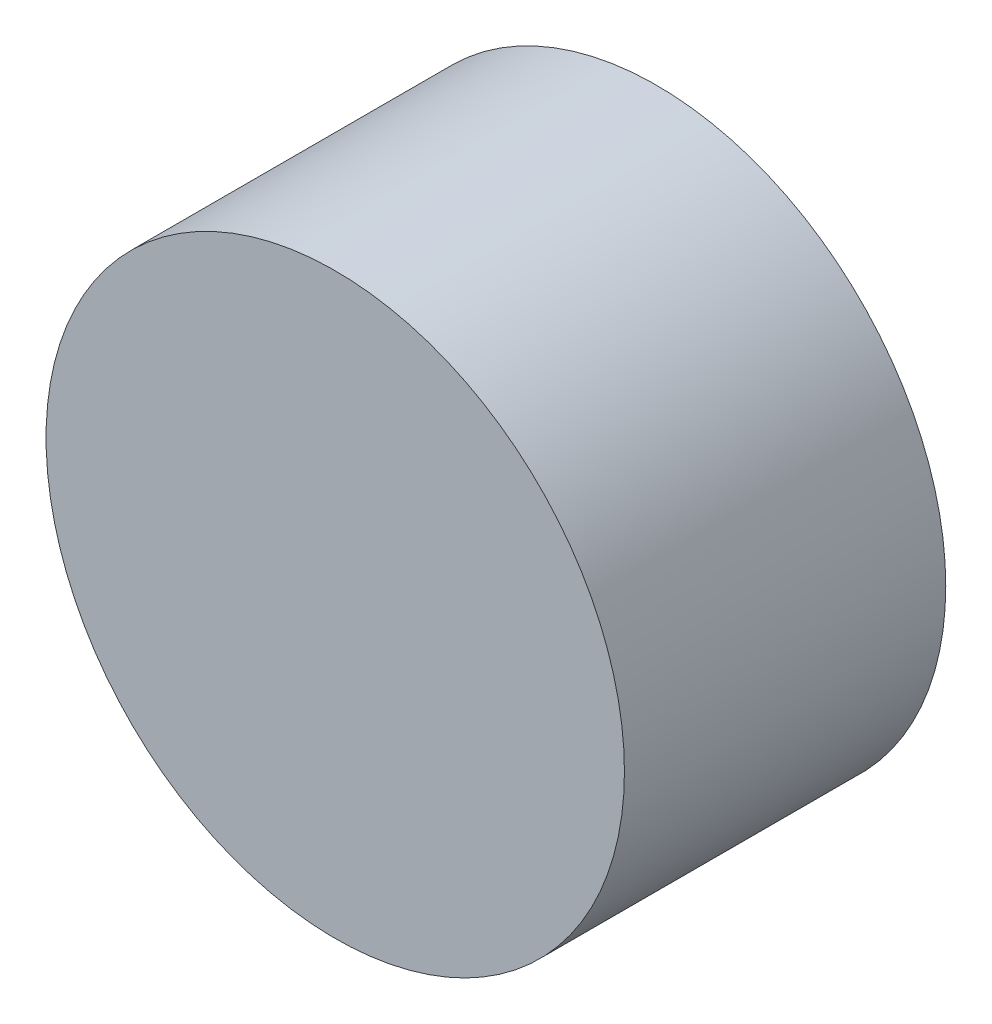
ISO-10303-21;
HEADER;
FILE_DESCRIPTION(('STEP AP214'),'2;1');
FILE_NAME('part.step','',(''),(''),'','','');
FILE_SCHEMA(('AUTOMOTIVE_DESIGN { 1 0 10303 214 1 1 1 1 }'));
ENDSEC;
DATA;
#1=APPLICATION_CONTEXT('core data for automotive mechanical design processes');
#2=APPLICATION_PROTOCOL_DEFINITION('international standard','automotive_design',2000,#1);
#3=PRODUCT_CONTEXT('',#1,'mechanical');
#4=PRODUCT('Part','Part','',(#3));
#5=PRODUCT_RELATED_PRODUCT_CATEGORY('part','',(#4));
#6=PRODUCT_DEFINITION_FORMATION('','',#4);
#7=PRODUCT_DEFINITION_CONTEXT('part definition',#1,'design');
#8=PRODUCT_DEFINITION('design','',#6,#7);
#9=PRODUCT_DEFINITION_SHAPE('','',#8);
#10=(LENGTH_UNIT() NAMED_UNIT(*) SI_UNIT(.MILLI.,.METRE.));
#11=(NAMED_UNIT(*) PLANE_ANGLE_UNIT() SI_UNIT($,.RADIAN.));
#12=(NAMED_UNIT(*) SI_UNIT($,.STERADIAN.) SOLID_ANGLE_UNIT());
#13=UNCERTAINTY_MEASURE_WITH_UNIT(LENGTH_MEASURE(1.E-05),#10,'distance_accuracy_value','');
#14=(GEOMETRIC_REPRESENTATION_CONTEXT(3) GLOBAL_UNCERTAINTY_ASSIGNED_CONTEXT((#13)) GLOBAL_UNIT_ASSIGNED_CONTEXT((#10,
#11,#12)) REPRESENTATION_CONTEXT('',''));
#15=CARTESIAN_POINT('',(0.,0.,0.));
#16=DIRECTION('',(0.,0.,1.));
#17=DIRECTION('',(1.,0.,0.));
#18=AXIS2_PLACEMENT_3D('',#15,#16,#17);
#19=CARTESIAN_POINT('',(0.,0.,18.));
#20=DIRECTION('',(0.,0.,-1.));
#21=DIRECTION('',(-1.,0.,0.));
#22=AXIS2_PLACEMENT_3D('',#19,#20,#21);
#23=CYLINDRICAL_SURFACE('',#22,14.4);
#24=CARTESIAN_POINT('',(0.,0.,18.));
#25=DIRECTION('',(0.,0.,1.));
#26=DIRECTION('',(1.,0.,0.));
#27=AXIS2_PLACEMENT_3D('',#24,#25,#26);
#28=CIRCLE('',#27,14.4);
#29=CARTESIAN_POINT('',(14.4,0.,18.));
#30=VERTEX_POINT('',#29);
#31=EDGE_CURVE('E10',#30,#30,#28,.T.);
#32=ORIENTED_EDGE('',*,*,#31,.F.);
#33=EDGE_LOOP('',(#32));
#34=FACE_BOUND('',#33,.T.);
#35=CARTESIAN_POINT('',(0.,0.,2.));
#36=DIRECTION('',(0.,0.,1.));
#37=DIRECTION('',(1.,0.,0.));
#38=AXIS2_PLACEMENT_3D('',#35,#36,#37);
#39=CIRCLE('',#38,14.4);
#40=CARTESIAN_POINT('',(14.4,0.,2.));
#41=VERTEX_POINT('',#40);
#42=EDGE_CURVE('E36',#41,#41,#39,.T.);
#43=ORIENTED_EDGE('',*,*,#42,.T.);
#44=EDGE_LOOP('',(#43));
#45=FACE_BOUND('',#44,.T.);
#46=ADVANCED_FACE('F33',(#34,#45),#23,.T.);
#47=CARTESIAN_POINT('',(0.,0.,18.));
#48=DIRECTION('',(0.,0.,1.));
#49=DIRECTION('',(1.,0.,0.));
#50=AXIS2_PLACEMENT_3D('',#47,#48,#49);
#51=PLANE('',#50);
#52=ORIENTED_EDGE('',*,*,#31,.T.);
#53=EDGE_LOOP('',(#52));
#54=FACE_BOUND('',#53,.T.);
#55=ADVANCED_FACE('F48',(#54),#51,.T.);
#56=CARTESIAN_POINT('',(0.,0.,2.));
#57=DIRECTION('',(0.,0.,1.));
#58=DIRECTION('',(1.,0.,0.));
#59=AXIS2_PLACEMENT_3D('',#56,#57,#58);
#60=PLANE('',#59);
#61=ORIENTED_EDGE('',*,*,#42,.F.);
#62=EDGE_LOOP('',(#61));
#63=FACE_BOUND('',#62,.T.);
#64=ADVANCED_FACE('F46',(#63),#60,.F.);
#65=CLOSED_SHELL('',(#46,#55,#64));
#66=MANIFOLD_SOLID_BREP('B2',#65);
#67=ADVANCED_BREP_SHAPE_REPRESENTATION('',(#18,#66),#14);
#68=SHAPE_DEFINITION_REPRESENTATION(#9,#67);
ENDSEC;
END-ISO-10303-21;
